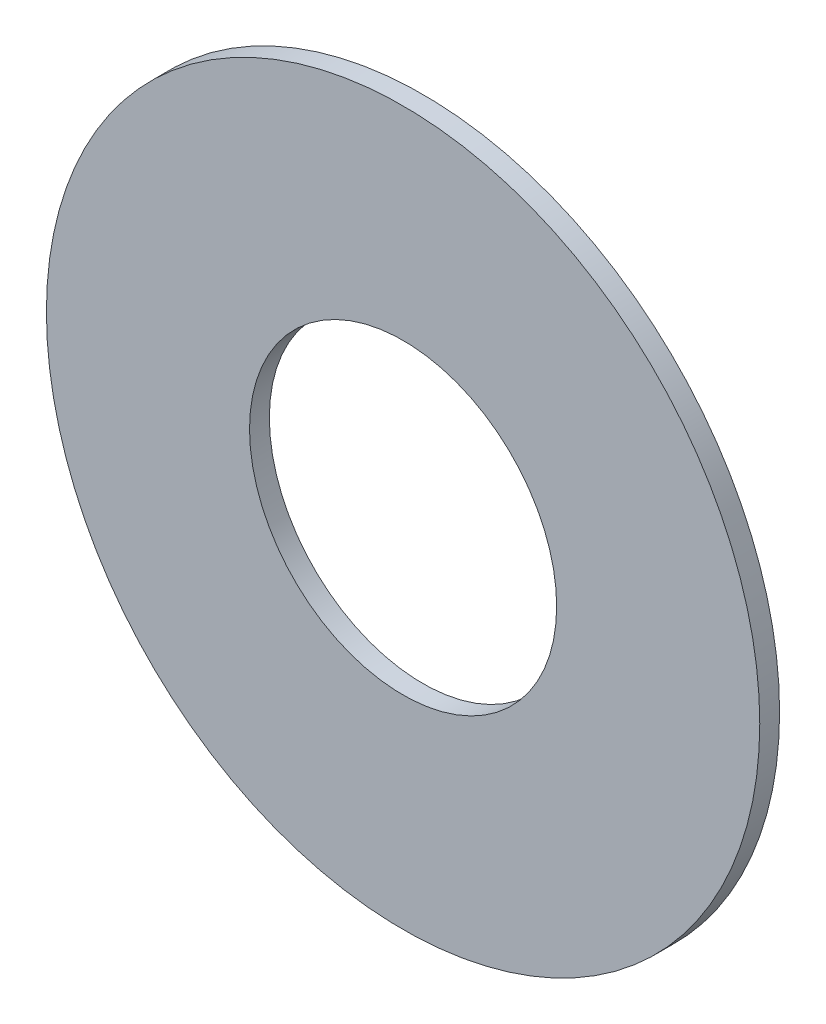
ISO-10303-21;
HEADER;
FILE_DESCRIPTION(('STEP AP214'),'2;1');
FILE_NAME('part.step','',(''),(''),'','','');
FILE_SCHEMA(('AUTOMOTIVE_DESIGN { 1 0 10303 214 1 1 1 1 }'));
ENDSEC;
DATA;
#1=APPLICATION_CONTEXT('core data for automotive mechanical design processes');
#2=APPLICATION_PROTOCOL_DEFINITION('international standard','automotive_design',2000,#1);
#3=PRODUCT_CONTEXT('',#1,'mechanical');
#4=PRODUCT('Part','Part','',(#3));
#5=PRODUCT_RELATED_PRODUCT_CATEGORY('part','',(#4));
#6=PRODUCT_DEFINITION_FORMATION('','',#4);
#7=PRODUCT_DEFINITION_CONTEXT('part definition',#1,'design');
#8=PRODUCT_DEFINITION('design','',#6,#7);
#9=PRODUCT_DEFINITION_SHAPE('','',#8);
#10=(LENGTH_UNIT() NAMED_UNIT(*) SI_UNIT(.MILLI.,.METRE.));
#11=(NAMED_UNIT(*) PLANE_ANGLE_UNIT() SI_UNIT($,.RADIAN.));
#12=(NAMED_UNIT(*) SI_UNIT($,.STERADIAN.) SOLID_ANGLE_UNIT());
#13=UNCERTAINTY_MEASURE_WITH_UNIT(LENGTH_MEASURE(1.E-05),#10,'distance_accuracy_value','');
#14=(GEOMETRIC_REPRESENTATION_CONTEXT(3) GLOBAL_UNCERTAINTY_ASSIGNED_CONTEXT((#13)) GLOBAL_UNIT_ASSIGNED_CONTEXT((#10,
#11,#12)) REPRESENTATION_CONTEXT('',''));
#15=CARTESIAN_POINT('',(0.,0.,0.));
#16=DIRECTION('',(0.,0.,1.));
#17=DIRECTION('',(1.,0.,0.));
#18=AXIS2_PLACEMENT_3D('',#15,#16,#17);
#19=CARTESIAN_POINT('',(-0.707224334600762,0.,2.));
#20=DIRECTION('',(0.,0.,1.));
#21=DIRECTION('',(1.,0.,0.));
#22=AXIS2_PLACEMENT_3D('',#19,#20,#21);
#23=PLANE('',#22);
#24=CARTESIAN_POINT('',(-0.707224334600762,0.,2.));
#25=DIRECTION('',(0.,0.,1.));
#26=DIRECTION('',(1.,0.,0.));
#27=AXIS2_PLACEMENT_3D('',#24,#25,#26);
#28=CIRCLE('',#27,36.);
#29=CARTESIAN_POINT('',(35.2927756653992,0.,2.));
#30=VERTEX_POINT('',#29);
#31=EDGE_CURVE('E10',#30,#30,#28,.T.);
#32=ORIENTED_EDGE('',*,*,#31,.T.);
#33=EDGE_LOOP('',(#32));
#34=FACE_BOUND('',#33,.T.);
#35=CARTESIAN_POINT('',(-0.707224334600762,0.,2.));
#36=DIRECTION('',(0.,0.,1.));
#37=DIRECTION('',(1.,0.,0.));
#38=AXIS2_PLACEMENT_3D('',#35,#36,#37);
#39=CIRCLE('',#38,15.5);
#40=CARTESIAN_POINT('',(14.7927756653992,0.,2.));
#41=VERTEX_POINT('',#40);
#42=EDGE_CURVE('E56',#41,#41,#39,.T.);
#43=ORIENTED_EDGE('',*,*,#42,.F.);
#44=EDGE_LOOP('',(#43));
#45=FACE_BOUND('',#44,.T.);
#46=ADVANCED_FACE('F43',(#34,#45),#23,.T.);
#47=CARTESIAN_POINT('',(-0.707224334600762,0.,0.));
#48=DIRECTION('',(0.,0.,1.));
#49=DIRECTION('',(1.,0.,0.));
#50=AXIS2_PLACEMENT_3D('',#47,#48,#49);
#51=PLANE('',#50);
#52=CARTESIAN_POINT('',(-0.707224334600762,0.,0.));
#53=DIRECTION('',(0.,0.,1.));
#54=DIRECTION('',(1.,0.,0.));
#55=AXIS2_PLACEMENT_3D('',#52,#53,#54);
#56=CIRCLE('',#55,36.);
#57=CARTESIAN_POINT('',(35.2927756653992,0.,0.));
#58=VERTEX_POINT('',#57);
#59=EDGE_CURVE('E47',#58,#58,#56,.T.);
#60=ORIENTED_EDGE('',*,*,#59,.F.);
#61=EDGE_LOOP('',(#60));
#62=FACE_BOUND('',#61,.T.);
#63=CARTESIAN_POINT('',(-0.707224334600762,0.,0.));
#64=DIRECTION('',(0.,0.,1.));
#65=DIRECTION('',(1.,0.,0.));
#66=AXIS2_PLACEMENT_3D('',#63,#64,#65);
#67=CIRCLE('',#66,15.5);
#68=CARTESIAN_POINT('',(14.7927756653992,0.,0.));
#69=VERTEX_POINT('',#68);
#70=EDGE_CURVE('E58',#69,#69,#67,.T.);
#71=ORIENTED_EDGE('',*,*,#70,.T.);
#72=EDGE_LOOP('',(#71));
#73=FACE_BOUND('',#72,.T.);
#74=ADVANCED_FACE('F70',(#62,#73),#51,.F.);
#75=CARTESIAN_POINT('',(-0.707224334600762,0.,2.));
#76=DIRECTION('',(0.,0.,-1.));
#77=DIRECTION('',(-1.,0.,0.));
#78=AXIS2_PLACEMENT_3D('',#75,#76,#77);
#79=CYLINDRICAL_SURFACE('',#78,36.);
#80=ORIENTED_EDGE('',*,*,#31,.F.);
#81=EDGE_LOOP('',(#80));
#82=FACE_BOUND('',#81,.T.);
#83=ORIENTED_EDGE('',*,*,#59,.T.);
#84=EDGE_LOOP('',(#83));
#85=FACE_BOUND('',#84,.T.);
#86=ADVANCED_FACE('F45',(#82,#85),#79,.T.);
#87=CARTESIAN_POINT('',(-0.707224334600762,0.,2.));
#88=DIRECTION('',(0.,0.,-1.));
#89=DIRECTION('',(-1.,0.,0.));
#90=AXIS2_PLACEMENT_3D('',#87,#88,#89);
#91=CYLINDRICAL_SURFACE('',#90,15.5);
#92=ORIENTED_EDGE('',*,*,#42,.T.);
#93=EDGE_LOOP('',(#92));
#94=FACE_BOUND('',#93,.T.);
#95=ORIENTED_EDGE('',*,*,#70,.F.);
#96=EDGE_LOOP('',(#95));
#97=FACE_BOUND('',#96,.T.);
#98=ADVANCED_FACE('F66',(#94,#97),#91,.F.);
#99=CLOSED_SHELL('',(#46,#74,#86,#98));
#100=MANIFOLD_SOLID_BREP('B2',#99);
#101=ADVANCED_BREP_SHAPE_REPRESENTATION('',(#18,#100),#14);
#102=SHAPE_DEFINITION_REPRESENTATION(#9,#101);
ENDSEC;
END-ISO-10303-21;
